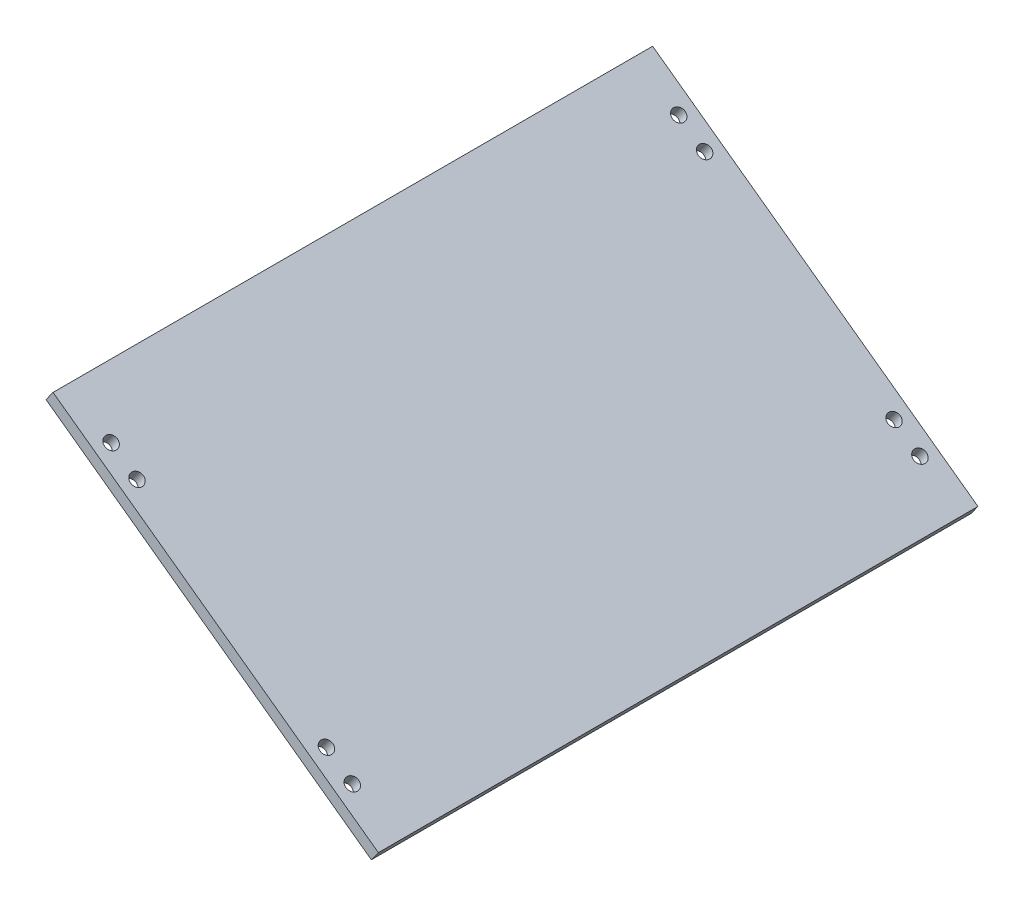
ISO-10303-21;
HEADER;
FILE_DESCRIPTION(('STEP AP214'),'2;1');
FILE_NAME('part.step','',(''),(''),'','','');
FILE_SCHEMA(('AUTOMOTIVE_DESIGN { 1 0 10303 214 1 1 1 1 }'));
ENDSEC;
DATA;
#1=APPLICATION_CONTEXT('core data for automotive mechanical design processes');
#2=APPLICATION_PROTOCOL_DEFINITION('international standard','automotive_design',2000,#1);
#3=PRODUCT_CONTEXT('',#1,'mechanical');
#4=PRODUCT('Part','Part','',(#3));
#5=PRODUCT_RELATED_PRODUCT_CATEGORY('part','',(#4));
#6=PRODUCT_DEFINITION_FORMATION('','',#4);
#7=PRODUCT_DEFINITION_CONTEXT('part definition',#1,'design');
#8=PRODUCT_DEFINITION('design','',#6,#7);
#9=PRODUCT_DEFINITION_SHAPE('','',#8);
#10=(LENGTH_UNIT() NAMED_UNIT(*) SI_UNIT(.MILLI.,.METRE.));
#11=(NAMED_UNIT(*) PLANE_ANGLE_UNIT() SI_UNIT($,.RADIAN.));
#12=(NAMED_UNIT(*) SI_UNIT($,.STERADIAN.) SOLID_ANGLE_UNIT());
#13=UNCERTAINTY_MEASURE_WITH_UNIT(LENGTH_MEASURE(1.E-05),#10,'distance_accuracy_value','');
#14=(GEOMETRIC_REPRESENTATION_CONTEXT(3) GLOBAL_UNCERTAINTY_ASSIGNED_CONTEXT((#13)) GLOBAL_UNIT_ASSIGNED_CONTEXT((#10,
#11,#12)) REPRESENTATION_CONTEXT('',''));
#15=CARTESIAN_POINT('',(0.,0.,0.));
#16=DIRECTION('',(0.,0.,1.));
#17=DIRECTION('',(1.,0.,0.));
#18=AXIS2_PLACEMENT_3D('',#15,#16,#17);
#19=CARTESIAN_POINT('',(9.56102804510622,112.931118592708,-47.1117165948132));
#20=DIRECTION('',(-0.809579504780941,0.58701024304406,0.));
#21=DIRECTION('',(-0.58701024304406,-0.809579504780941,0.));
#22=AXIS2_PLACEMENT_3D('',#19,#20,#21);
#23=PLANE('',#22);
#24=DIRECTION('',(0.,0.,1.));
#25=VECTOR('',#24,1.);
#26=CARTESIAN_POINT('',(11.3220587742384,115.359857107051,-47.1117165948132));
#27=LINE('',#26,#25);
#28=CARTESIAN_POINT('',(11.3220587742384,115.359857107051,-47.1117165948132));
#29=VERTEX_POINT('',#28);
#30=CARTESIAN_POINT('',(11.3220587742384,115.359857107051,102.839929224189));
#31=VERTEX_POINT('',#30);
#32=EDGE_CURVE('E121',#29,#31,#27,.T.);
#33=ORIENTED_EDGE('',*,*,#32,.F.);
#34=DIRECTION('',(0.58701024304406,0.809579504780941,0.));
#35=VECTOR('',#34,1.);
#36=CARTESIAN_POINT('',(9.56102804510622,112.931118592708,-47.1117165948132));
#37=LINE('',#36,#35);
#38=CARTESIAN_POINT('',(9.56102804510622,112.931118592708,-47.1117165948132));
#39=VERTEX_POINT('',#38);
#40=EDGE_CURVE('E11',#39,#29,#37,.T.);
#41=ORIENTED_EDGE('',*,*,#40,.F.);
#42=DIRECTION('',(0.,0.,1.));
#43=VECTOR('',#42,1.);
#44=CARTESIAN_POINT('',(9.56102804510622,112.931118592708,-47.1117165948132));
#45=LINE('',#44,#43);
#46=CARTESIAN_POINT('',(9.56102804510622,112.931118592708,102.839929224189));
#47=VERTEX_POINT('',#46);
#48=EDGE_CURVE('E111',#39,#47,#45,.T.);
#49=ORIENTED_EDGE('',*,*,#48,.T.);
#50=DIRECTION('',(0.58701024304406,0.809579504780941,0.));
#51=VECTOR('',#50,1.);
#52=CARTESIAN_POINT('',(9.56102804510622,112.931118592708,102.839929224189));
#53=LINE('',#52,#51);
#54=EDGE_CURVE('E52',#47,#31,#53,.T.);
#55=ORIENTED_EDGE('',*,*,#54,.T.);
#56=EDGE_LOOP('',(#33,#41,#49,#55));
#57=FACE_BOUND('',#56,.T.);
#58=ADVANCED_FACE('F49',(#57),#23,.T.);
#59=CARTESIAN_POINT('',(9.56102804510622,112.931118592708,-47.1117165948132));
#60=DIRECTION('',(0.,0.,-1.));
#61=DIRECTION('',(-1.,0.,0.));
#62=AXIS2_PLACEMENT_3D('',#59,#60,#61);
#63=PLANE('',#62);
#64=DIRECTION('',(-0.809579504780941,0.58701024304406,0.));
#65=VECTOR('',#64,1.);
#66=CARTESIAN_POINT('',(11.3220587742384,115.359857107051,-47.1117165948132));
#67=LINE('',#66,#65);
#68=CARTESIAN_POINT('',(92.6856541241525,56.364707650772,-47.1117165948132));
#69=VERTEX_POINT('',#68);
#70=EDGE_CURVE('E115',#69,#29,#67,.T.);
#71=ORIENTED_EDGE('',*,*,#70,.F.);
#72=DIRECTION('',(0.58701024304406,0.809579504780941,0.));
#73=VECTOR('',#72,1.);
#74=CARTESIAN_POINT('',(90.9246233950204,53.9359691364291,-47.1117165948132));
#75=LINE('',#74,#73);
#76=CARTESIAN_POINT('',(90.9246233950204,53.9359691364291,-47.1117165948132));
#77=VERTEX_POINT('',#76);
#78=EDGE_CURVE('E59',#77,#69,#75,.T.);
#79=ORIENTED_EDGE('',*,*,#78,.F.);
#80=DIRECTION('',(-0.809579504780941,0.58701024304406,0.));
#81=VECTOR('',#80,1.);
#82=CARTESIAN_POINT('',(9.56102804510622,112.931118592708,-47.1117165948132));
#83=LINE('',#82,#81);
#84=EDGE_CURVE('E106',#77,#39,#83,.T.);
#85=ORIENTED_EDGE('',*,*,#84,.T.);
#86=ORIENTED_EDGE('',*,*,#40,.T.);
#87=EDGE_LOOP('',(#71,#79,#85,#86));
#88=FACE_BOUND('',#87,.T.);
#89=ADVANCED_FACE('F144',(#88),#63,.T.);
#90=CARTESIAN_POINT('',(90.9246233950204,53.9359691364291,-47.1117165948132));
#91=DIRECTION('',(0.809579504780941,-0.58701024304406,0.));
#92=DIRECTION('',(0.58701024304406,0.809579504780941,0.));
#93=AXIS2_PLACEMENT_3D('',#90,#91,#92);
#94=PLANE('',#93);
#95=DIRECTION('',(0.,0.,-1.));
#96=VECTOR('',#95,1.);
#97=CARTESIAN_POINT('',(92.6856541241525,56.364707650772,-47.1117165948132));
#98=LINE('',#97,#96);
#99=CARTESIAN_POINT('',(92.6856541241525,56.364707650772,102.839929224189));
#100=VERTEX_POINT('',#99);
#101=EDGE_CURVE('E100',#100,#69,#98,.T.);
#102=ORIENTED_EDGE('',*,*,#101,.F.);
#103=DIRECTION('',(0.58701024304406,0.809579504780941,0.));
#104=VECTOR('',#103,1.);
#105=CARTESIAN_POINT('',(90.9246233950204,53.9359691364291,102.839929224189));
#106=LINE('',#105,#104);
#107=CARTESIAN_POINT('',(90.9246233950204,53.9359691364291,102.839929224189));
#108=VERTEX_POINT('',#107);
#109=EDGE_CURVE('E95',#108,#100,#106,.T.);
#110=ORIENTED_EDGE('',*,*,#109,.F.);
#111=DIRECTION('',(0.,0.,-1.));
#112=VECTOR('',#111,1.);
#113=CARTESIAN_POINT('',(90.9246233950204,53.9359691364291,-47.1117165948132));
#114=LINE('',#113,#112);
#115=EDGE_CURVE('E98',#108,#77,#114,.T.);
#116=ORIENTED_EDGE('',*,*,#115,.T.);
#117=ORIENTED_EDGE('',*,*,#78,.T.);
#118=EDGE_LOOP('',(#102,#110,#116,#117));
#119=FACE_BOUND('',#118,.T.);
#120=ADVANCED_FACE('F97',(#119),#94,.T.);
#121=CARTESIAN_POINT('',(9.56102804510622,112.931118592708,102.839929224189));
#122=DIRECTION('',(0.,0.,1.));
#123=DIRECTION('',(1.,0.,0.));
#124=AXIS2_PLACEMENT_3D('',#121,#122,#123);
#125=PLANE('',#124);
#126=DIRECTION('',(0.809579504780941,-0.58701024304406,0.));
#127=VECTOR('',#126,1.);
#128=CARTESIAN_POINT('',(11.3220587742384,115.359857107051,102.839929224189));
#129=LINE('',#128,#127);
#130=EDGE_CURVE('E125',#31,#100,#129,.T.);
#131=ORIENTED_EDGE('',*,*,#130,.F.);
#132=ORIENTED_EDGE('',*,*,#54,.F.);
#133=DIRECTION('',(0.809579504780941,-0.58701024304406,0.));
#134=VECTOR('',#133,1.);
#135=CARTESIAN_POINT('',(9.56102804510622,112.931118592708,102.839929224189));
#136=LINE('',#135,#134);
#137=EDGE_CURVE('E105',#47,#108,#136,.T.);
#138=ORIENTED_EDGE('',*,*,#137,.T.);
#139=ORIENTED_EDGE('',*,*,#109,.T.);
#140=EDGE_LOOP('',(#131,#132,#138,#139));
#141=FACE_BOUND('',#140,.T.);
#142=ADVANCED_FACE('F109',(#141),#125,.T.);
#143=CARTESIAN_POINT('',(56.9629694268869,78.5608992789068,0.));
#144=DIRECTION('',(0.58701024304406,0.809579504780941,0.));
#145=DIRECTION('',(-0.809579504780941,0.58701024304406,0.));
#146=AXIS2_PLACEMENT_3D('',#143,#144,#145);
#147=PLANE('',#146);
#148=CARTESIAN_POINT('',(20.0855616072585,105.299985433135,98.8399292241886));
#149=DIRECTION('',(0.58701024304406,0.809579504780941,0.));
#150=DIRECTION('',(0.809579504780941,-0.58701024304406,0.));
#151=AXIS2_PLACEMENT_3D('',#148,#149,#150);
#152=CIRCLE('',#151,1.6);
#153=CARTESIAN_POINT('',(21.380888814908,104.360769044265,98.8399292241886));
#154=VERTEX_POINT('',#153);
#155=EDGE_CURVE('E201',#154,#154,#152,.T.);
#156=ORIENTED_EDGE('',*,*,#155,.T.);
#157=EDGE_LOOP('',(#156));
#158=FACE_BOUND('',#157,.T.);
#159=CARTESIAN_POINT('',(26.562197645506,100.603903488783,98.8399292241886));
#160=DIRECTION('',(0.58701024304406,0.809579504780941,0.));
#161=DIRECTION('',(0.809579504780941,-0.58701024304406,0.));
#162=AXIS2_PLACEMENT_3D('',#159,#160,#161);
#163=CIRCLE('',#162,1.6);
#164=CARTESIAN_POINT('',(27.8575248531555,99.664687099912,98.8399292241886));
#165=VERTEX_POINT('',#164);
#166=EDGE_CURVE('E212',#165,#165,#163,.T.);
#167=ORIENTED_EDGE('',*,*,#166,.T.);
#168=EDGE_LOOP('',(#167));
#169=FACE_BOUND('',#168,.T.);
#170=CARTESIAN_POINT('',(73.9234537946206,66.2631842403544,98.8399292241886));
#171=DIRECTION('',(0.58701024304406,0.809579504780941,0.));
#172=DIRECTION('',(0.809579504780941,-0.58701024304406,0.));
#173=AXIS2_PLACEMENT_3D('',#170,#171,#172);
#174=CIRCLE('',#173,1.6);
#175=CARTESIAN_POINT('',(75.2187810022701,65.3239678514839,98.8399292241886));
#176=VERTEX_POINT('',#175);
#177=EDGE_CURVE('E220',#176,#176,#174,.T.);
#178=ORIENTED_EDGE('',*,*,#177,.T.);
#179=EDGE_LOOP('',(#178));
#180=FACE_BOUND('',#179,.T.);
#181=CARTESIAN_POINT('',(80.4000898328682,61.5671022960019,98.8399292241886));
#182=DIRECTION('',(0.58701024304406,0.809579504780941,0.));
#183=DIRECTION('',(0.809579504780941,-0.58701024304406,0.));
#184=AXIS2_PLACEMENT_3D('',#181,#182,#183);
#185=CIRCLE('',#184,1.60000000000001);
#186=CARTESIAN_POINT('',(81.6954170405177,60.6278859071314,98.8399292241886));
#187=VERTEX_POINT('',#186);
#188=EDGE_CURVE('E228',#187,#187,#185,.T.);
#189=ORIENTED_EDGE('',*,*,#188,.T.);
#190=EDGE_LOOP('',(#189));
#191=FACE_BOUND('',#190,.T.);
#192=CARTESIAN_POINT('',(80.4000898328681,61.5671022960019,-43.1117165948132));
#193=DIRECTION('',(0.58701024304406,0.809579504780941,0.));
#194=DIRECTION('',(-0.809579504780941,0.58701024304406,0.));
#195=AXIS2_PLACEMENT_3D('',#192,#193,#194);
#196=CIRCLE('',#195,1.60000000000001);
#197=CARTESIAN_POINT('',(79.1047626252186,62.5063186848724,-43.1117165948132));
#198=VERTEX_POINT('',#197);
#199=EDGE_CURVE('E236',#198,#198,#196,.T.);
#200=ORIENTED_EDGE('',*,*,#199,.T.);
#201=EDGE_LOOP('',(#200));
#202=FACE_BOUND('',#201,.T.);
#203=CARTESIAN_POINT('',(73.9234537946206,66.2631842403544,-43.1117165948132));
#204=DIRECTION('',(0.58701024304406,0.809579504780941,0.));
#205=DIRECTION('',(-0.809579504780941,0.58701024304406,0.));
#206=AXIS2_PLACEMENT_3D('',#203,#204,#205);
#207=CIRCLE('',#206,1.60000000000001);
#208=CARTESIAN_POINT('',(72.6281265869711,67.2024006292249,-43.1117165948132));
#209=VERTEX_POINT('',#208);
#210=EDGE_CURVE('E244',#209,#209,#207,.T.);
#211=ORIENTED_EDGE('',*,*,#210,.T.);
#212=EDGE_LOOP('',(#211));
#213=FACE_BOUND('',#212,.T.);
#214=CARTESIAN_POINT('',(26.562197645506,100.603903488783,-43.1117165948132));
#215=DIRECTION('',(0.58701024304406,0.809579504780941,0.));
#216=DIRECTION('',(-0.809579504780941,0.58701024304406,0.));
#217=AXIS2_PLACEMENT_3D('',#214,#215,#216);
#218=CIRCLE('',#217,1.6);
#219=CARTESIAN_POINT('',(25.2668704378565,101.543119877653,-43.1117165948132));
#220=VERTEX_POINT('',#219);
#221=EDGE_CURVE('E252',#220,#220,#218,.T.);
#222=ORIENTED_EDGE('',*,*,#221,.T.);
#223=EDGE_LOOP('',(#222));
#224=FACE_BOUND('',#223,.T.);
#225=CARTESIAN_POINT('',(20.0855616072584,105.299985433135,-43.1117165948132));
#226=DIRECTION('',(0.58701024304406,0.809579504780941,0.));
#227=DIRECTION('',(-0.809579504780941,0.58701024304406,0.));
#228=AXIS2_PLACEMENT_3D('',#225,#226,#227);
#229=CIRCLE('',#228,1.6);
#230=CARTESIAN_POINT('',(18.7902343996089,106.239201822006,-43.1117165948132));
#231=VERTEX_POINT('',#230);
#232=EDGE_CURVE('E126',#231,#231,#229,.T.);
#233=ORIENTED_EDGE('',*,*,#232,.T.);
#234=EDGE_LOOP('',(#233));
#235=FACE_BOUND('',#234,.T.);
#236=ORIENTED_EDGE('',*,*,#48,.F.);
#237=ORIENTED_EDGE('',*,*,#84,.F.);
#238=ORIENTED_EDGE('',*,*,#115,.F.);
#239=ORIENTED_EDGE('',*,*,#137,.F.);
#240=EDGE_LOOP('',(#236,#237,#238,#239));
#241=FACE_BOUND('',#240,.T.);
#242=ADVANCED_FACE('F104',(#158,#169,#180,#191,#202,#213,#224,#235,#241),#147,.F.);
#243=CARTESIAN_POINT('',(58.7240001560191,80.9896377932496,0.));
#244=DIRECTION('',(0.58701024304406,0.809579504780941,0.));
#245=DIRECTION('',(-0.809579504780941,0.58701024304406,0.));
#246=AXIS2_PLACEMENT_3D('',#243,#244,#245);
#247=PLANE('',#246);
#248=CARTESIAN_POINT('',(21.8465923363907,107.728723947478,98.8399292241886));
#249=DIRECTION('',(0.58701024304406,0.809579504780941,0.));
#250=DIRECTION('',(0.809579504780941,-0.58701024304406,0.));
#251=AXIS2_PLACEMENT_3D('',#248,#249,#250);
#252=CIRCLE('',#251,1.6);
#253=CARTESIAN_POINT('',(23.1419195440402,106.789507558607,98.8399292241886));
#254=VERTEX_POINT('',#253);
#255=EDGE_CURVE('E204',#254,#254,#252,.T.);
#256=ORIENTED_EDGE('',*,*,#255,.F.);
#257=EDGE_LOOP('',(#256));
#258=FACE_BOUND('',#257,.T.);
#259=CARTESIAN_POINT('',(28.3232283746382,103.032642003125,98.8399292241886));
#260=DIRECTION('',(0.58701024304406,0.809579504780941,0.));
#261=DIRECTION('',(0.809579504780941,-0.58701024304406,0.));
#262=AXIS2_PLACEMENT_3D('',#259,#260,#261);
#263=CIRCLE('',#262,1.6);
#264=CARTESIAN_POINT('',(29.6185555822877,102.093425614255,98.8399292241886));
#265=VERTEX_POINT('',#264);
#266=EDGE_CURVE('E209',#265,#265,#263,.T.);
#267=ORIENTED_EDGE('',*,*,#266,.F.);
#268=EDGE_LOOP('',(#267));
#269=FACE_BOUND('',#268,.T.);
#270=CARTESIAN_POINT('',(75.6844845237528,68.6919227546972,98.8399292241886));
#271=DIRECTION('',(0.58701024304406,0.809579504780941,0.));
#272=DIRECTION('',(0.809579504780941,-0.58701024304406,0.));
#273=AXIS2_PLACEMENT_3D('',#270,#271,#272);
#274=CIRCLE('',#273,1.6);
#275=CARTESIAN_POINT('',(76.9798117314023,67.7527063658267,98.8399292241886));
#276=VERTEX_POINT('',#275);
#277=EDGE_CURVE('E216',#276,#276,#274,.T.);
#278=ORIENTED_EDGE('',*,*,#277,.F.);
#279=EDGE_LOOP('',(#278));
#280=FACE_BOUND('',#279,.T.);
#281=CARTESIAN_POINT('',(82.1611205620003,63.9958408103447,98.8399292241886));
#282=DIRECTION('',(0.58701024304406,0.809579504780941,0.));
#283=DIRECTION('',(0.809579504780941,-0.58701024304406,0.));
#284=AXIS2_PLACEMENT_3D('',#281,#282,#283);
#285=CIRCLE('',#284,1.60000000000001);
#286=CARTESIAN_POINT('',(83.4564477696498,63.0566244214742,98.8399292241886));
#287=VERTEX_POINT('',#286);
#288=EDGE_CURVE('E224',#287,#287,#285,.T.);
#289=ORIENTED_EDGE('',*,*,#288,.F.);
#290=EDGE_LOOP('',(#289));
#291=FACE_BOUND('',#290,.T.);
#292=CARTESIAN_POINT('',(82.1611205620003,63.9958408103448,-43.1117165948132));
#293=DIRECTION('',(0.58701024304406,0.809579504780941,0.));
#294=DIRECTION('',(-0.809579504780941,0.58701024304406,0.));
#295=AXIS2_PLACEMENT_3D('',#292,#293,#294);
#296=CIRCLE('',#295,1.60000000000001);
#297=CARTESIAN_POINT('',(80.8657933543508,64.9350571992153,-43.1117165948132));
#298=VERTEX_POINT('',#297);
#299=EDGE_CURVE('E232',#298,#298,#296,.T.);
#300=ORIENTED_EDGE('',*,*,#299,.F.);
#301=EDGE_LOOP('',(#300));
#302=FACE_BOUND('',#301,.T.);
#303=CARTESIAN_POINT('',(75.6844845237528,68.6919227546972,-43.1117165948132));
#304=DIRECTION('',(0.58701024304406,0.809579504780941,0.));
#305=DIRECTION('',(-0.809579504780941,0.58701024304406,0.));
#306=AXIS2_PLACEMENT_3D('',#303,#304,#305);
#307=CIRCLE('',#306,1.60000000000001);
#308=CARTESIAN_POINT('',(74.3891573161033,69.6311391435677,-43.1117165948132));
#309=VERTEX_POINT('',#308);
#310=EDGE_CURVE('E240',#309,#309,#307,.T.);
#311=ORIENTED_EDGE('',*,*,#310,.F.);
#312=EDGE_LOOP('',(#311));
#313=FACE_BOUND('',#312,.T.);
#314=CARTESIAN_POINT('',(28.3232283746382,103.032642003125,-43.1117165948132));
#315=DIRECTION('',(0.58701024304406,0.809579504780941,0.));
#316=DIRECTION('',(-0.809579504780941,0.58701024304406,0.));
#317=AXIS2_PLACEMENT_3D('',#314,#315,#316);
#318=CIRCLE('',#317,1.6);
#319=CARTESIAN_POINT('',(27.0279011669887,103.971858391996,-43.1117165948132));
#320=VERTEX_POINT('',#319);
#321=EDGE_CURVE('E248',#320,#320,#318,.T.);
#322=ORIENTED_EDGE('',*,*,#321,.F.);
#323=EDGE_LOOP('',(#322));
#324=FACE_BOUND('',#323,.T.);
#325=CARTESIAN_POINT('',(21.8465923363906,107.728723947478,-43.1117165948132));
#326=DIRECTION('',(0.58701024304406,0.809579504780941,0.));
#327=DIRECTION('',(-0.809579504780941,0.58701024304406,0.));
#328=AXIS2_PLACEMENT_3D('',#325,#326,#327);
#329=CIRCLE('',#328,1.6);
#330=CARTESIAN_POINT('',(20.5512651287411,108.667940336348,-43.1117165948132));
#331=VERTEX_POINT('',#330);
#332=EDGE_CURVE('E256',#331,#331,#329,.T.);
#333=ORIENTED_EDGE('',*,*,#332,.F.);
#334=EDGE_LOOP('',(#333));
#335=FACE_BOUND('',#334,.T.);
#336=ORIENTED_EDGE('',*,*,#32,.T.);
#337=ORIENTED_EDGE('',*,*,#130,.T.);
#338=ORIENTED_EDGE('',*,*,#101,.T.);
#339=ORIENTED_EDGE('',*,*,#70,.T.);
#340=EDGE_LOOP('',(#336,#337,#338,#339));
#341=FACE_BOUND('',#340,.T.);
#342=ADVANCED_FACE('F143',(#258,#269,#280,#291,#302,#313,#324,#335,#341),#247,.T.);
#343=CARTESIAN_POINT('',(20.0855616072584,105.299985433135,-43.1117165948132));
#344=DIRECTION('',(0.58701024304406,0.809579504780941,0.));
#345=DIRECTION('',(-0.809579504780941,0.58701024304406,0.));
#346=AXIS2_PLACEMENT_3D('',#343,#344,#345);
#347=CYLINDRICAL_SURFACE('',#346,1.6);
#348=ORIENTED_EDGE('',*,*,#232,.F.);
#349=EDGE_LOOP('',(#348));
#350=FACE_BOUND('',#349,.T.);
#351=ORIENTED_EDGE('',*,*,#332,.T.);
#352=EDGE_LOOP('',(#351));
#353=FACE_BOUND('',#352,.T.);
#354=ADVANCED_FACE('F162',(#350,#353),#347,.F.);
#355=CARTESIAN_POINT('',(26.562197645506,100.603903488783,-43.1117165948132));
#356=DIRECTION('',(0.58701024304406,0.809579504780941,0.));
#357=DIRECTION('',(-0.809579504780941,0.58701024304406,0.));
#358=AXIS2_PLACEMENT_3D('',#355,#356,#357);
#359=CYLINDRICAL_SURFACE('',#358,1.6);
#360=ORIENTED_EDGE('',*,*,#221,.F.);
#361=EDGE_LOOP('',(#360));
#362=FACE_BOUND('',#361,.T.);
#363=ORIENTED_EDGE('',*,*,#321,.T.);
#364=EDGE_LOOP('',(#363));
#365=FACE_BOUND('',#364,.T.);
#366=ADVANCED_FACE('F169',(#362,#365),#359,.F.);
#367=CARTESIAN_POINT('',(73.9234537946206,66.2631842403544,-43.1117165948132));
#368=DIRECTION('',(0.58701024304406,0.809579504780941,0.));
#369=DIRECTION('',(-0.809579504780941,0.58701024304406,0.));
#370=AXIS2_PLACEMENT_3D('',#367,#368,#369);
#371=CYLINDRICAL_SURFACE('',#370,1.60000000000001);
#372=ORIENTED_EDGE('',*,*,#210,.F.);
#373=EDGE_LOOP('',(#372));
#374=FACE_BOUND('',#373,.T.);
#375=ORIENTED_EDGE('',*,*,#310,.T.);
#376=EDGE_LOOP('',(#375));
#377=FACE_BOUND('',#376,.T.);
#378=ADVANCED_FACE('F173',(#374,#377),#371,.F.);
#379=CARTESIAN_POINT('',(80.4000898328681,61.5671022960019,-43.1117165948132));
#380=DIRECTION('',(0.58701024304406,0.809579504780941,0.));
#381=DIRECTION('',(-0.809579504780941,0.58701024304406,0.));
#382=AXIS2_PLACEMENT_3D('',#379,#380,#381);
#383=CYLINDRICAL_SURFACE('',#382,1.60000000000001);
#384=ORIENTED_EDGE('',*,*,#199,.F.);
#385=EDGE_LOOP('',(#384));
#386=FACE_BOUND('',#385,.T.);
#387=ORIENTED_EDGE('',*,*,#299,.T.);
#388=EDGE_LOOP('',(#387));
#389=FACE_BOUND('',#388,.T.);
#390=ADVANCED_FACE('F177',(#386,#389),#383,.F.);
#391=CARTESIAN_POINT('',(80.4000898328682,61.5671022960019,98.8399292241886));
#392=DIRECTION('',(0.58701024304406,0.809579504780941,0.));
#393=DIRECTION('',(-0.809579504780941,0.58701024304406,0.));
#394=AXIS2_PLACEMENT_3D('',#391,#392,#393);
#395=CYLINDRICAL_SURFACE('',#394,1.60000000000001);
#396=ORIENTED_EDGE('',*,*,#188,.F.);
#397=EDGE_LOOP('',(#396));
#398=FACE_BOUND('',#397,.T.);
#399=ORIENTED_EDGE('',*,*,#288,.T.);
#400=EDGE_LOOP('',(#399));
#401=FACE_BOUND('',#400,.T.);
#402=ADVANCED_FACE('F181',(#398,#401),#395,.F.);
#403=CARTESIAN_POINT('',(73.9234537946206,66.2631842403544,98.8399292241886));
#404=DIRECTION('',(0.58701024304406,0.809579504780941,0.));
#405=DIRECTION('',(-0.809579504780941,0.58701024304406,0.));
#406=AXIS2_PLACEMENT_3D('',#403,#404,#405);
#407=CYLINDRICAL_SURFACE('',#406,1.6);
#408=ORIENTED_EDGE('',*,*,#177,.F.);
#409=EDGE_LOOP('',(#408));
#410=FACE_BOUND('',#409,.T.);
#411=ORIENTED_EDGE('',*,*,#277,.T.);
#412=EDGE_LOOP('',(#411));
#413=FACE_BOUND('',#412,.T.);
#414=ADVANCED_FACE('F185',(#410,#413),#407,.F.);
#415=CARTESIAN_POINT('',(26.562197645506,100.603903488783,98.8399292241886));
#416=DIRECTION('',(0.58701024304406,0.809579504780941,0.));
#417=DIRECTION('',(-0.809579504780941,0.58701024304406,0.));
#418=AXIS2_PLACEMENT_3D('',#415,#416,#417);
#419=CYLINDRICAL_SURFACE('',#418,1.6);
#420=ORIENTED_EDGE('',*,*,#166,.F.);
#421=EDGE_LOOP('',(#420));
#422=FACE_BOUND('',#421,.T.);
#423=ORIENTED_EDGE('',*,*,#266,.T.);
#424=EDGE_LOOP('',(#423));
#425=FACE_BOUND('',#424,.T.);
#426=ADVANCED_FACE('F189',(#422,#425),#419,.F.);
#427=CARTESIAN_POINT('',(20.0855616072585,105.299985433135,98.8399292241886));
#428=DIRECTION('',(0.58701024304406,0.809579504780941,0.));
#429=DIRECTION('',(-0.809579504780941,0.58701024304406,0.));
#430=AXIS2_PLACEMENT_3D('',#427,#428,#429);
#431=CYLINDRICAL_SURFACE('',#430,1.6);
#432=ORIENTED_EDGE('',*,*,#155,.F.);
#433=EDGE_LOOP('',(#432));
#434=FACE_BOUND('',#433,.T.);
#435=ORIENTED_EDGE('',*,*,#255,.T.);
#436=EDGE_LOOP('',(#435));
#437=FACE_BOUND('',#436,.T.);
#438=ADVANCED_FACE('F193',(#434,#437),#431,.F.);
#439=CLOSED_SHELL('',(#58,#89,#120,#142,#242,#342,#354,#366,#378,#390,#402,#414,#426,#438));
#440=MANIFOLD_SOLID_BREP('B2',#439);
#441=ADVANCED_BREP_SHAPE_REPRESENTATION('',(#18,#440),#14);
#442=SHAPE_DEFINITION_REPRESENTATION(#9,#441);
ENDSEC;
END-ISO-10303-21;
